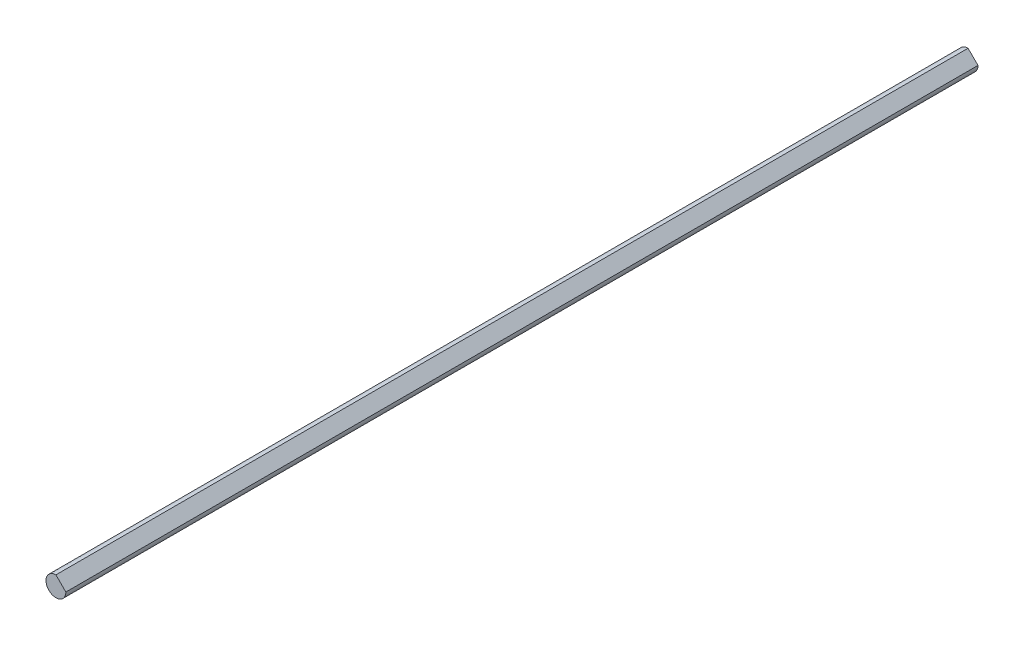
ISO-10303-21;
HEADER;
FILE_DESCRIPTION(('STEP AP214'),'2;1');
FILE_NAME('part.step','',(''),(''),'','','');
FILE_SCHEMA(('AUTOMOTIVE_DESIGN { 1 0 10303 214 1 1 1 1 }'));
ENDSEC;
DATA;
#1=APPLICATION_CONTEXT('core data for automotive mechanical design processes');
#2=APPLICATION_PROTOCOL_DEFINITION('international standard','automotive_design',2000,#1);
#3=PRODUCT_CONTEXT('',#1,'mechanical');
#4=PRODUCT('Part','Part','',(#3));
#5=PRODUCT_RELATED_PRODUCT_CATEGORY('part','',(#4));
#6=PRODUCT_DEFINITION_FORMATION('','',#4);
#7=PRODUCT_DEFINITION_CONTEXT('part definition',#1,'design');
#8=PRODUCT_DEFINITION('design','',#6,#7);
#9=PRODUCT_DEFINITION_SHAPE('','',#8);
#10=(LENGTH_UNIT() NAMED_UNIT(*) SI_UNIT(.MILLI.,.METRE.));
#11=(NAMED_UNIT(*) PLANE_ANGLE_UNIT() SI_UNIT($,.RADIAN.));
#12=(NAMED_UNIT(*) SI_UNIT($,.STERADIAN.) SOLID_ANGLE_UNIT());
#13=UNCERTAINTY_MEASURE_WITH_UNIT(LENGTH_MEASURE(1.E-05),#10,'distance_accuracy_value','');
#14=(GEOMETRIC_REPRESENTATION_CONTEXT(3) GLOBAL_UNCERTAINTY_ASSIGNED_CONTEXT((#13)) GLOBAL_UNIT_ASSIGNED_CONTEXT((#10,
#11,#12)) REPRESENTATION_CONTEXT('',''));
#15=CARTESIAN_POINT('',(0.,0.,0.));
#16=DIRECTION('',(0.,0.,1.));
#17=DIRECTION('',(1.,0.,0.));
#18=AXIS2_PLACEMENT_3D('',#15,#16,#17);
#19=CARTESIAN_POINT('',(0.,0.,350.));
#20=DIRECTION('',(0.,0.,-1.));
#21=DIRECTION('',(-1.,0.,0.));
#22=AXIS2_PLACEMENT_3D('',#19,#20,#21);
#23=CYLINDRICAL_SURFACE('',#22,3.81);
#24=CARTESIAN_POINT('',(0.,0.,0.));
#25=DIRECTION('',(0.,0.,1.));
#26=DIRECTION('',(1.,0.,0.));
#27=AXIS2_PLACEMENT_3D('',#24,#25,#26);
#28=CIRCLE('',#27,3.81);
#29=CARTESIAN_POINT('',(0.,3.81,0.));
#30=VERTEX_POINT('',#29);
#31=CARTESIAN_POINT('',(3.81,0.,0.));
#32=VERTEX_POINT('',#31);
#33=EDGE_CURVE('E65',#30,#32,#28,.T.);
#34=ORIENTED_EDGE('',*,*,#33,.T.);
#35=DIRECTION('',(0.,0.,-1.));
#36=VECTOR('',#35,1.);
#37=CARTESIAN_POINT('',(3.81,0.,350.));
#38=LINE('',#37,#36);
#39=CARTESIAN_POINT('',(3.81,0.,350.));
#40=VERTEX_POINT('',#39);
#41=EDGE_CURVE('E11',#40,#32,#38,.T.);
#42=ORIENTED_EDGE('',*,*,#41,.F.);
#43=CARTESIAN_POINT('',(0.,0.,350.));
#44=DIRECTION('',(0.,0.,1.));
#45=DIRECTION('',(1.,0.,0.));
#46=AXIS2_PLACEMENT_3D('',#43,#44,#45);
#47=CIRCLE('',#46,3.81);
#48=CARTESIAN_POINT('',(0.,3.81,350.));
#49=VERTEX_POINT('',#48);
#50=EDGE_CURVE('E64',#49,#40,#47,.T.);
#51=ORIENTED_EDGE('',*,*,#50,.F.);
#52=DIRECTION('',(0.,0.,-1.));
#53=VECTOR('',#52,1.);
#54=CARTESIAN_POINT('',(0.,3.81,350.));
#55=LINE('',#54,#53);
#56=EDGE_CURVE('E42',#49,#30,#55,.T.);
#57=ORIENTED_EDGE('',*,*,#56,.T.);
#58=EDGE_LOOP('',(#34,#42,#51,#57));
#59=FACE_BOUND('',#58,.T.);
#60=ADVANCED_FACE('F34',(#59),#23,.T.);
#61=CARTESIAN_POINT('',(0.,3.81,350.));
#62=DIRECTION('',(-0.707106781186548,-0.707106781186548,0.));
#63=DIRECTION('',(0.707106781186548,-0.707106781186548,0.));
#64=AXIS2_PLACEMENT_3D('',#61,#62,#63);
#65=PLANE('',#64);
#66=DIRECTION('',(-0.707106781186547,0.707106781186547,0.));
#67=VECTOR('',#66,1.);
#68=CARTESIAN_POINT('',(0.,3.81,0.));
#69=LINE('',#68,#67);
#70=EDGE_CURVE('E57',#32,#30,#69,.T.);
#71=ORIENTED_EDGE('',*,*,#70,.T.);
#72=ORIENTED_EDGE('',*,*,#56,.F.);
#73=DIRECTION('',(-0.707106781186547,0.707106781186547,0.));
#74=VECTOR('',#73,1.);
#75=CARTESIAN_POINT('',(0.,3.81,350.));
#76=LINE('',#75,#74);
#77=EDGE_CURVE('E49',#40,#49,#76,.T.);
#78=ORIENTED_EDGE('',*,*,#77,.F.);
#79=ORIENTED_EDGE('',*,*,#41,.T.);
#80=EDGE_LOOP('',(#71,#72,#78,#79));
#81=FACE_BOUND('',#80,.T.);
#82=ADVANCED_FACE('F60',(#81),#65,.F.);
#83=CARTESIAN_POINT('',(0.,0.,350.));
#84=DIRECTION('',(0.,0.,1.));
#85=DIRECTION('',(1.,0.,0.));
#86=AXIS2_PLACEMENT_3D('',#83,#84,#85);
#87=PLANE('',#86);
#88=ORIENTED_EDGE('',*,*,#50,.T.);
#89=ORIENTED_EDGE('',*,*,#77,.T.);
#90=EDGE_LOOP('',(#88,#89));
#91=FACE_BOUND('',#90,.T.);
#92=ADVANCED_FACE('F72',(#91),#87,.T.);
#93=CARTESIAN_POINT('',(0.,0.,0.));
#94=DIRECTION('',(0.,0.,1.));
#95=DIRECTION('',(1.,0.,0.));
#96=AXIS2_PLACEMENT_3D('',#93,#94,#95);
#97=PLANE('',#96);
#98=ORIENTED_EDGE('',*,*,#33,.F.);
#99=ORIENTED_EDGE('',*,*,#70,.F.);
#100=EDGE_LOOP('',(#98,#99));
#101=FACE_BOUND('',#100,.T.);
#102=ADVANCED_FACE('F68',(#101),#97,.F.);
#103=CLOSED_SHELL('',(#60,#82,#92,#102));
#104=MANIFOLD_SOLID_BREP('B2',#103);
#105=ADVANCED_BREP_SHAPE_REPRESENTATION('',(#18,#104),#14);
#106=SHAPE_DEFINITION_REPRESENTATION(#9,#105);
ENDSEC;
END-ISO-10303-21;
